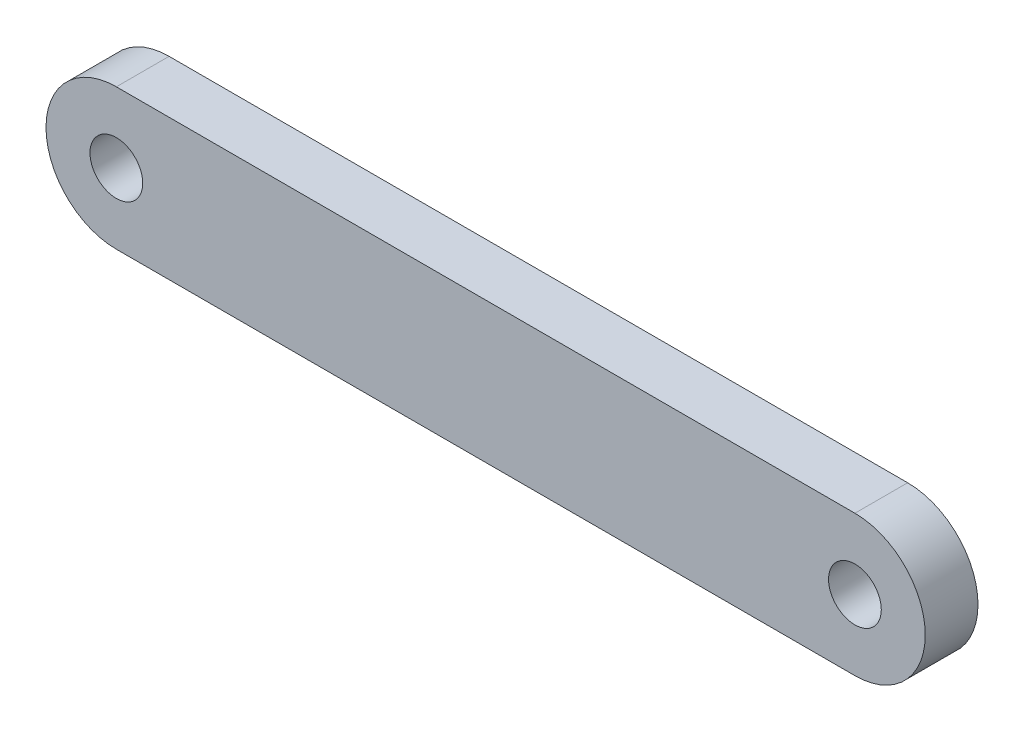
ISO-10303-21;
HEADER;
FILE_DESCRIPTION(('STEP AP214'),'2;1');
FILE_NAME('part.step','',(''),(''),'','','');
FILE_SCHEMA(('AUTOMOTIVE_DESIGN { 1 0 10303 214 1 1 1 1 }'));
ENDSEC;
DATA;
#1=APPLICATION_CONTEXT('core data for automotive mechanical design processes');
#2=APPLICATION_PROTOCOL_DEFINITION('international standard','automotive_design',2000,#1);
#3=PRODUCT_CONTEXT('',#1,'mechanical');
#4=PRODUCT('Part','Part','',(#3));
#5=PRODUCT_RELATED_PRODUCT_CATEGORY('part','',(#4));
#6=PRODUCT_DEFINITION_FORMATION('','',#4);
#7=PRODUCT_DEFINITION_CONTEXT('part definition',#1,'design');
#8=PRODUCT_DEFINITION('design','',#6,#7);
#9=PRODUCT_DEFINITION_SHAPE('','',#8);
#10=(LENGTH_UNIT() NAMED_UNIT(*) SI_UNIT(.MILLI.,.METRE.));
#11=(NAMED_UNIT(*) PLANE_ANGLE_UNIT() SI_UNIT($,.RADIAN.));
#12=(NAMED_UNIT(*) SI_UNIT($,.STERADIAN.) SOLID_ANGLE_UNIT());
#13=UNCERTAINTY_MEASURE_WITH_UNIT(LENGTH_MEASURE(1.E-05),#10,'distance_accuracy_value','');
#14=(GEOMETRIC_REPRESENTATION_CONTEXT(3) GLOBAL_UNCERTAINTY_ASSIGNED_CONTEXT((#13)) GLOBAL_UNIT_ASSIGNED_CONTEXT((#10,
#11,#12)) REPRESENTATION_CONTEXT('',''));
#15=CARTESIAN_POINT('',(0.,0.,0.));
#16=DIRECTION('',(0.,0.,1.));
#17=DIRECTION('',(1.,0.,0.));
#18=AXIS2_PLACEMENT_3D('',#15,#16,#17);
#19=CARTESIAN_POINT('',(-105.,0.,15.));
#20=DIRECTION('',(0.,0.,-1.));
#21=DIRECTION('',(-1.,0.,0.));
#22=AXIS2_PLACEMENT_3D('',#19,#20,#21);
#23=CYLINDRICAL_SURFACE('',#22,20.);
#24=CARTESIAN_POINT('',(-105.,0.,0.));
#25=DIRECTION('',(0.,0.,1.));
#26=DIRECTION('',(1.,0.,0.));
#27=AXIS2_PLACEMENT_3D('',#24,#25,#26);
#28=CIRCLE('',#27,20.);
#29=CARTESIAN_POINT('',(-105.,20.,0.));
#30=VERTEX_POINT('',#29);
#31=CARTESIAN_POINT('',(-105.,-20.,0.));
#32=VERTEX_POINT('',#31);
#33=EDGE_CURVE('E102',#30,#32,#28,.T.);
#34=ORIENTED_EDGE('',*,*,#33,.T.);
#35=DIRECTION('',(0.,0.,-1.));
#36=VECTOR('',#35,1.);
#37=CARTESIAN_POINT('',(-105.,-20.,15.));
#38=LINE('',#37,#36);
#39=CARTESIAN_POINT('',(-105.,-20.,15.));
#40=VERTEX_POINT('',#39);
#41=EDGE_CURVE('E11',#40,#32,#38,.T.);
#42=ORIENTED_EDGE('',*,*,#41,.F.);
#43=CARTESIAN_POINT('',(-105.,0.,15.));
#44=DIRECTION('',(0.,0.,1.));
#45=DIRECTION('',(1.,0.,0.));
#46=AXIS2_PLACEMENT_3D('',#43,#44,#45);
#47=CIRCLE('',#46,20.);
#48=CARTESIAN_POINT('',(-105.,20.,15.));
#49=VERTEX_POINT('',#48);
#50=EDGE_CURVE('E90',#49,#40,#47,.T.);
#51=ORIENTED_EDGE('',*,*,#50,.F.);
#52=DIRECTION('',(0.,0.,-1.));
#53=VECTOR('',#52,1.);
#54=CARTESIAN_POINT('',(-105.,20.,15.));
#55=LINE('',#54,#53);
#56=EDGE_CURVE('E98',#49,#30,#55,.T.);
#57=ORIENTED_EDGE('',*,*,#56,.T.);
#58=EDGE_LOOP('',(#34,#42,#51,#57));
#59=FACE_BOUND('',#58,.T.);
#60=ADVANCED_FACE('F39',(#59),#23,.T.);
#61=CARTESIAN_POINT('',(-105.,-20.,15.));
#62=DIRECTION('',(0.,1.,0.));
#63=DIRECTION('',(0.,0.,1.));
#64=AXIS2_PLACEMENT_3D('',#61,#62,#63);
#65=PLANE('',#64);
#66=DIRECTION('',(1.,0.,0.));
#67=VECTOR('',#66,1.);
#68=CARTESIAN_POINT('',(-105.,-20.,0.));
#69=LINE('',#68,#67);
#70=CARTESIAN_POINT('',(105.,-20.,0.));
#71=VERTEX_POINT('',#70);
#72=EDGE_CURVE('E94',#32,#71,#69,.T.);
#73=ORIENTED_EDGE('',*,*,#72,.T.);
#74=DIRECTION('',(0.,0.,-1.));
#75=VECTOR('',#74,1.);
#76=CARTESIAN_POINT('',(105.,-20.,15.));
#77=LINE('',#76,#75);
#78=CARTESIAN_POINT('',(105.,-20.,15.));
#79=VERTEX_POINT('',#78);
#80=EDGE_CURVE('E47',#79,#71,#77,.T.);
#81=ORIENTED_EDGE('',*,*,#80,.F.);
#82=DIRECTION('',(1.,0.,0.));
#83=VECTOR('',#82,1.);
#84=CARTESIAN_POINT('',(-105.,-20.,15.));
#85=LINE('',#84,#83);
#86=EDGE_CURVE('E85',#40,#79,#85,.T.);
#87=ORIENTED_EDGE('',*,*,#86,.F.);
#88=ORIENTED_EDGE('',*,*,#41,.T.);
#89=EDGE_LOOP('',(#73,#81,#87,#88));
#90=FACE_BOUND('',#89,.T.);
#91=ADVANCED_FACE('F93',(#90),#65,.F.);
#92=CARTESIAN_POINT('',(105.,0.,15.));
#93=DIRECTION('',(0.,0.,-1.));
#94=DIRECTION('',(-1.,0.,0.));
#95=AXIS2_PLACEMENT_3D('',#92,#93,#94);
#96=CYLINDRICAL_SURFACE('',#95,20.);
#97=CARTESIAN_POINT('',(105.,0.,0.));
#98=DIRECTION('',(0.,0.,1.));
#99=DIRECTION('',(-1.,0.,0.));
#100=AXIS2_PLACEMENT_3D('',#97,#98,#99);
#101=CIRCLE('',#100,20.);
#102=CARTESIAN_POINT('',(105.,20.,0.));
#103=VERTEX_POINT('',#102);
#104=EDGE_CURVE('E72',#71,#103,#101,.T.);
#105=ORIENTED_EDGE('',*,*,#104,.T.);
#106=DIRECTION('',(0.,0.,-1.));
#107=VECTOR('',#106,1.);
#108=CARTESIAN_POINT('',(105.,20.,15.));
#109=LINE('',#108,#107);
#110=CARTESIAN_POINT('',(105.,20.,15.));
#111=VERTEX_POINT('',#110);
#112=EDGE_CURVE('E95',#111,#103,#109,.T.);
#113=ORIENTED_EDGE('',*,*,#112,.F.);
#114=CARTESIAN_POINT('',(105.,0.,15.));
#115=DIRECTION('',(0.,0.,1.));
#116=DIRECTION('',(-1.,0.,0.));
#117=AXIS2_PLACEMENT_3D('',#114,#115,#116);
#118=CIRCLE('',#117,20.);
#119=EDGE_CURVE('E88',#79,#111,#118,.T.);
#120=ORIENTED_EDGE('',*,*,#119,.F.);
#121=ORIENTED_EDGE('',*,*,#80,.T.);
#122=EDGE_LOOP('',(#105,#113,#120,#121));
#123=FACE_BOUND('',#122,.T.);
#124=ADVANCED_FACE('F96',(#123),#96,.T.);
#125=CARTESIAN_POINT('',(-105.,20.,15.));
#126=DIRECTION('',(0.,-1.,0.));
#127=DIRECTION('',(0.,0.,-1.));
#128=AXIS2_PLACEMENT_3D('',#125,#126,#127);
#129=PLANE('',#128);
#130=DIRECTION('',(-1.,0.,0.));
#131=VECTOR('',#130,1.);
#132=CARTESIAN_POINT('',(-105.,20.,0.));
#133=LINE('',#132,#131);
#134=EDGE_CURVE('E78',#103,#30,#133,.T.);
#135=ORIENTED_EDGE('',*,*,#134,.T.);
#136=ORIENTED_EDGE('',*,*,#56,.F.);
#137=DIRECTION('',(-1.,0.,0.));
#138=VECTOR('',#137,1.);
#139=CARTESIAN_POINT('',(-105.,20.,15.));
#140=LINE('',#139,#138);
#141=EDGE_CURVE('E55',#111,#49,#140,.T.);
#142=ORIENTED_EDGE('',*,*,#141,.F.);
#143=ORIENTED_EDGE('',*,*,#112,.T.);
#144=EDGE_LOOP('',(#135,#136,#142,#143));
#145=FACE_BOUND('',#144,.T.);
#146=ADVANCED_FACE('F110',(#145),#129,.F.);
#147=CARTESIAN_POINT('',(-105.,0.,15.));
#148=DIRECTION('',(0.,0.,1.));
#149=DIRECTION('',(1.,0.,0.));
#150=AXIS2_PLACEMENT_3D('',#147,#148,#149);
#151=PLANE('',#150);
#152=CARTESIAN_POINT('',(-105.,0.,15.));
#153=DIRECTION('',(0.,0.,-1.));
#154=DIRECTION('',(-1.,0.,0.));
#155=AXIS2_PLACEMENT_3D('',#152,#153,#154);
#156=CIRCLE('',#155,7.5);
#157=CARTESIAN_POINT('',(-112.5,0.,15.));
#158=VERTEX_POINT('',#157);
#159=EDGE_CURVE('E122',#158,#158,#156,.T.);
#160=ORIENTED_EDGE('',*,*,#159,.T.);
#161=EDGE_LOOP('',(#160));
#162=FACE_BOUND('',#161,.T.);
#163=CARTESIAN_POINT('',(105.,0.,15.));
#164=DIRECTION('',(0.,0.,1.));
#165=DIRECTION('',(1.,0.,0.));
#166=AXIS2_PLACEMENT_3D('',#163,#164,#165);
#167=CIRCLE('',#166,7.5);
#168=CARTESIAN_POINT('',(112.5,0.,15.));
#169=VERTEX_POINT('',#168);
#170=EDGE_CURVE('E116',#169,#169,#167,.T.);
#171=ORIENTED_EDGE('',*,*,#170,.F.);
#172=EDGE_LOOP('',(#171));
#173=FACE_BOUND('',#172,.T.);
#174=ORIENTED_EDGE('',*,*,#50,.T.);
#175=ORIENTED_EDGE('',*,*,#86,.T.);
#176=ORIENTED_EDGE('',*,*,#119,.T.);
#177=ORIENTED_EDGE('',*,*,#141,.T.);
#178=EDGE_LOOP('',(#174,#175,#176,#177));
#179=FACE_BOUND('',#178,.T.);
#180=ADVANCED_FACE('F86',(#162,#173,#179),#151,.T.);
#181=CARTESIAN_POINT('',(-105.,0.,0.));
#182=DIRECTION('',(0.,0.,1.));
#183=DIRECTION('',(1.,0.,0.));
#184=AXIS2_PLACEMENT_3D('',#181,#182,#183);
#185=PLANE('',#184);
#186=CARTESIAN_POINT('',(-105.,0.,0.));
#187=DIRECTION('',(0.,0.,-1.));
#188=DIRECTION('',(-1.,0.,0.));
#189=AXIS2_PLACEMENT_3D('',#186,#187,#188);
#190=CIRCLE('',#189,7.5);
#191=CARTESIAN_POINT('',(-112.5,0.,0.));
#192=VERTEX_POINT('',#191);
#193=EDGE_CURVE('E119',#192,#192,#190,.T.);
#194=ORIENTED_EDGE('',*,*,#193,.F.);
#195=EDGE_LOOP('',(#194));
#196=FACE_BOUND('',#195,.T.);
#197=CARTESIAN_POINT('',(105.,0.,0.));
#198=DIRECTION('',(0.,0.,1.));
#199=DIRECTION('',(1.,0.,0.));
#200=AXIS2_PLACEMENT_3D('',#197,#198,#199);
#201=CIRCLE('',#200,7.5);
#202=CARTESIAN_POINT('',(112.5,0.,0.));
#203=VERTEX_POINT('',#202);
#204=EDGE_CURVE('E105',#203,#203,#201,.T.);
#205=ORIENTED_EDGE('',*,*,#204,.T.);
#206=EDGE_LOOP('',(#205));
#207=FACE_BOUND('',#206,.T.);
#208=ORIENTED_EDGE('',*,*,#33,.F.);
#209=ORIENTED_EDGE('',*,*,#134,.F.);
#210=ORIENTED_EDGE('',*,*,#104,.F.);
#211=ORIENTED_EDGE('',*,*,#72,.F.);
#212=EDGE_LOOP('',(#208,#209,#210,#211));
#213=FACE_BOUND('',#212,.T.);
#214=ADVANCED_FACE('F113',(#196,#207,#213),#185,.F.);
#215=CARTESIAN_POINT('',(105.,0.,0.));
#216=DIRECTION('',(0.,0.,1.));
#217=DIRECTION('',(1.,0.,0.));
#218=AXIS2_PLACEMENT_3D('',#215,#216,#217);
#219=CYLINDRICAL_SURFACE('',#218,7.5);
#220=ORIENTED_EDGE('',*,*,#204,.F.);
#221=EDGE_LOOP('',(#220));
#222=FACE_BOUND('',#221,.T.);
#223=ORIENTED_EDGE('',*,*,#170,.T.);
#224=EDGE_LOOP('',(#223));
#225=FACE_BOUND('',#224,.T.);
#226=ADVANCED_FACE('F133',(#222,#225),#219,.F.);
#227=CARTESIAN_POINT('',(-105.,0.,0.));
#228=DIRECTION('',(0.,0.,1.));
#229=DIRECTION('',(1.,0.,0.));
#230=AXIS2_PLACEMENT_3D('',#227,#228,#229);
#231=CYLINDRICAL_SURFACE('',#230,7.5);
#232=ORIENTED_EDGE('',*,*,#193,.T.);
#233=EDGE_LOOP('',(#232));
#234=FACE_BOUND('',#233,.T.);
#235=ORIENTED_EDGE('',*,*,#159,.F.);
#236=EDGE_LOOP('',(#235));
#237=FACE_BOUND('',#236,.T.);
#238=ADVANCED_FACE('F128',(#234,#237),#231,.F.);
#239=CLOSED_SHELL('',(#60,#91,#124,#146,#180,#214,#226,#238));
#240=MANIFOLD_SOLID_BREP('B2',#239);
#241=ADVANCED_BREP_SHAPE_REPRESENTATION('',(#18,#240),#14);
#242=SHAPE_DEFINITION_REPRESENTATION(#9,#241);
ENDSEC;
END-ISO-10303-21;
